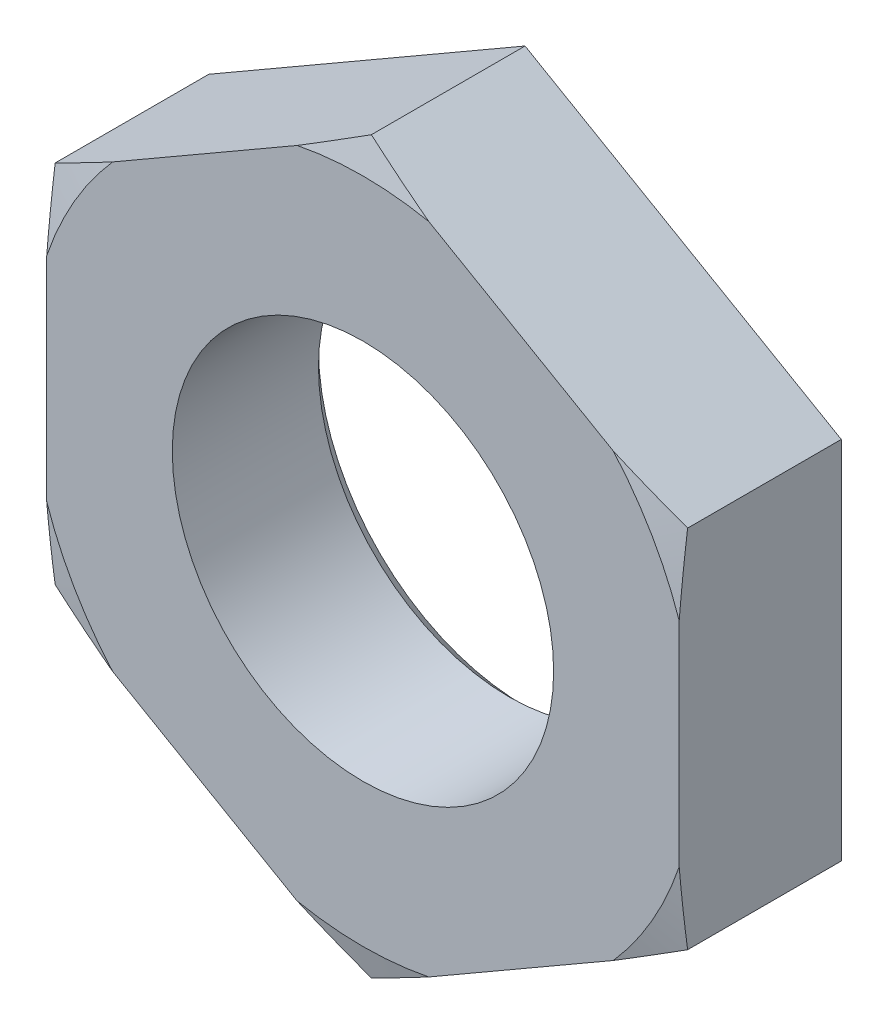
ISO-10303-21;
HEADER;
FILE_DESCRIPTION(('STEP AP214'),'2;1');
FILE_NAME('part.step','',(''),(''),'','','');
FILE_SCHEMA(('AUTOMOTIVE_DESIGN { 1 0 10303 214 1 1 1 1 }'));
ENDSEC;
DATA;
#1=APPLICATION_CONTEXT('core data for automotive mechanical design processes');
#2=APPLICATION_PROTOCOL_DEFINITION('international standard','automotive_design',2000,#1);
#3=PRODUCT_CONTEXT('',#1,'mechanical');
#4=PRODUCT('Part','Part','',(#3));
#5=PRODUCT_RELATED_PRODUCT_CATEGORY('part','',(#4));
#6=PRODUCT_DEFINITION_FORMATION('','',#4);
#7=PRODUCT_DEFINITION_CONTEXT('part definition',#1,'design');
#8=PRODUCT_DEFINITION('design','',#6,#7);
#9=PRODUCT_DEFINITION_SHAPE('','',#8);
#10=(LENGTH_UNIT() NAMED_UNIT(*) SI_UNIT(.MILLI.,.METRE.));
#11=(NAMED_UNIT(*) PLANE_ANGLE_UNIT() SI_UNIT($,.RADIAN.));
#12=(NAMED_UNIT(*) SI_UNIT($,.STERADIAN.) SOLID_ANGLE_UNIT());
#13=UNCERTAINTY_MEASURE_WITH_UNIT(LENGTH_MEASURE(1.E-05),#10,'distance_accuracy_value','');
#14=(GEOMETRIC_REPRESENTATION_CONTEXT(3) GLOBAL_UNCERTAINTY_ASSIGNED_CONTEXT((#13)) GLOBAL_UNIT_ASSIGNED_CONTEXT((#10,
#11,#12)) REPRESENTATION_CONTEXT('',''));
#15=CARTESIAN_POINT('',(0.,0.,0.));
#16=DIRECTION('',(0.,0.,1.));
#17=DIRECTION('',(1.,0.,0.));
#18=AXIS2_PLACEMENT_3D('',#15,#16,#17);
#19=CARTESIAN_POINT('',(0.,3.83,1.7));
#20=DIRECTION('',(0.,0.,1.));
#21=DIRECTION('',(1.,0.,0.));
#22=AXIS2_PLACEMENT_3D('',#19,#20,#21);
#23=PLANE('',#22);
#24=CARTESIAN_POINT('',(0.,0.,1.7));
#25=DIRECTION('',(0.,0.,1.));
#26=DIRECTION('',(1.,0.,0.));
#27=AXIS2_PLACEMENT_3D('',#24,#25,#26);
#28=CIRCLE('',#27,2.);
#29=CARTESIAN_POINT('',(2.,0.,1.7));
#30=VERTEX_POINT('',#29);
#31=EDGE_CURVE('E162',#30,#30,#28,.T.);
#32=ORIENTED_EDGE('',*,*,#31,.F.);
#33=EDGE_LOOP('',(#32));
#34=FACE_BOUND('',#33,.T.);
#35=DIRECTION('',(0.,1.,0.));
#36=VECTOR('',#35,1.);
#37=CARTESIAN_POINT('',(3.3168772964944,-1.915,1.7));
#38=LINE('',#37,#36);
#39=CARTESIAN_POINT('',(3.3168772964944,-1.11728465486644,1.7));
#40=VERTEX_POINT('',#39);
#41=CARTESIAN_POINT('',(3.3168772964944,1.11728465486644,1.7));
#42=VERTEX_POINT('',#41);
#43=EDGE_CURVE('E146',#40,#42,#38,.T.);
#44=ORIENTED_EDGE('',*,*,#43,.T.);
#45=CARTESIAN_POINT('',(0.,0.,1.7));
#46=DIRECTION('',(0.,0.,1.));
#47=DIRECTION('',(1.,0.,0.));
#48=AXIS2_PLACEMENT_3D('',#45,#46,#47);
#49=CIRCLE('',#48,3.5);
#50=CARTESIAN_POINT('',(2.62603554262006,2.31385767256678,1.7));
#51=VERTEX_POINT('',#50);
#52=EDGE_CURVE('E131',#42,#51,#49,.T.);
#53=ORIENTED_EDGE('',*,*,#52,.T.);
#54=DIRECTION('',(-0.866025403784439,0.5,0.));
#55=VECTOR('',#54,1.);
#56=CARTESIAN_POINT('',(3.3168772964944,1.915,1.7));
#57=LINE('',#56,#55);
#58=CARTESIAN_POINT('',(0.690841753874339,3.43114232743322,1.7));
#59=VERTEX_POINT('',#58);
#60=EDGE_CURVE('E143',#51,#59,#57,.T.);
#61=ORIENTED_EDGE('',*,*,#60,.T.);
#62=CARTESIAN_POINT('',(-0.690841753874347,3.43114232743322,1.7));
#63=VERTEX_POINT('',#62);
#64=EDGE_CURVE('E147',#59,#63,#49,.T.);
#65=ORIENTED_EDGE('',*,*,#64,.T.);
#66=DIRECTION('',(-0.866025403784439,-0.5,0.));
#67=VECTOR('',#66,1.);
#68=CARTESIAN_POINT('',(0.,3.83,1.7));
#69=LINE('',#68,#67);
#70=CARTESIAN_POINT('',(-2.62603554262006,2.31385767256679,1.7));
#71=VERTEX_POINT('',#70);
#72=EDGE_CURVE('E152',#63,#71,#69,.T.);
#73=ORIENTED_EDGE('',*,*,#72,.T.);
#74=CARTESIAN_POINT('',(-3.3168772964944,1.11728465486643,1.7));
#75=VERTEX_POINT('',#74);
#76=EDGE_CURVE('E316',#71,#75,#49,.T.);
#77=ORIENTED_EDGE('',*,*,#76,.T.);
#78=DIRECTION('',(0.,-1.,0.));
#79=VECTOR('',#78,1.);
#80=CARTESIAN_POINT('',(-3.3168772964944,1.915,1.7));
#81=LINE('',#80,#79);
#82=CARTESIAN_POINT('',(-3.3168772964944,-1.11728465486643,1.7));
#83=VERTEX_POINT('',#82);
#84=EDGE_CURVE('E156',#75,#83,#81,.T.);
#85=ORIENTED_EDGE('',*,*,#84,.T.);
#86=CARTESIAN_POINT('',(-2.62603554262006,-2.31385767256679,1.7));
#87=VERTEX_POINT('',#86);
#88=EDGE_CURVE('E314',#83,#87,#49,.T.);
#89=ORIENTED_EDGE('',*,*,#88,.T.);
#90=DIRECTION('',(0.866025403784439,-0.5,0.));
#91=VECTOR('',#90,1.);
#92=CARTESIAN_POINT('',(-3.3168772964944,-1.915,1.7));
#93=LINE('',#92,#91);
#94=CARTESIAN_POINT('',(-0.690841753874343,-3.43114232743322,1.7));
#95=VERTEX_POINT('',#94);
#96=EDGE_CURVE('E167',#87,#95,#93,.T.);
#97=ORIENTED_EDGE('',*,*,#96,.T.);
#98=CARTESIAN_POINT('',(0.690841753874338,-3.43114232743322,1.7));
#99=VERTEX_POINT('',#98);
#100=EDGE_CURVE('E317',#95,#99,#49,.T.);
#101=ORIENTED_EDGE('',*,*,#100,.T.);
#102=DIRECTION('',(0.866025403784439,0.5,0.));
#103=VECTOR('',#102,1.);
#104=CARTESIAN_POINT('',(0.,-3.83,1.7));
#105=LINE('',#104,#103);
#106=CARTESIAN_POINT('',(2.62603554262006,-2.31385767256678,1.7));
#107=VERTEX_POINT('',#106);
#108=EDGE_CURVE('E170',#99,#107,#105,.T.);
#109=ORIENTED_EDGE('',*,*,#108,.T.);
#110=EDGE_CURVE('E149',#107,#40,#49,.T.);
#111=ORIENTED_EDGE('',*,*,#110,.T.);
#112=EDGE_LOOP('',(#44,#53,#61,#65,#73,#77,#85,#89,#97,#101,#109,#111));
#113=FACE_BOUND('',#112,.T.);
#114=ADVANCED_FACE('F40',(#34,#113),#23,.T.);
#115=CARTESIAN_POINT('',(3.3168772964944,1.915,1.7));
#116=DIRECTION('',(-0.5,-0.866025403784439,0.));
#117=DIRECTION('',(0.866025403784439,-0.5,0.));
#118=AXIS2_PLACEMENT_3D('',#115,#116,#117);
#119=PLANE('',#118);
#120=CARTESIAN_POINT('',(5.83127776582853,0.463310212179416,1.07041199792404));
#121=CARTESIAN_POINT('',(5.72454057004419,0.524934960898053,1.09761167825971));
#122=CARTESIAN_POINT('',(5.61774329277782,0.586594397676514,1.12449721546284));
#123=CARTESIAN_POINT('',(5.4040056099263,0.709995906406806,1.17751349561719));
#124=CARTESIAN_POINT('',(5.29706520078815,0.771737980409962,1.20364421945372));
#125=CARTESIAN_POINT('',(4.97591681139783,0.957153089474277,1.28073302611032));
#126=CARTESIAN_POINT('',(4.76146753073402,1.08096543939305,1.33036565078184));
#127=CARTESIAN_POINT('',(4.33045714599396,1.32980940104625,1.42491878920381));
#128=CARTESIAN_POINT('',(4.11389107107299,1.45484388269921,1.4698094791682));
#129=CARTESIAN_POINT('',(3.67971957745825,1.70551291141215,1.55238021606378));
#130=CARTESIAN_POINT('',(3.46211419427549,1.83114743796982,1.59006050757825));
#131=CARTESIAN_POINT('',(3.03064158356245,2.08025826591295,1.65455481637842));
#132=CARTESIAN_POINT('',(2.81680078209559,2.20371931020356,1.68159481106668));
#133=CARTESIAN_POINT('',(2.49536833235979,2.38929842158481,1.71264945493049));
#134=CARTESIAN_POINT('',(2.38811767692694,2.45121961636972,1.72141657780274));
#135=CARTESIAN_POINT('',(2.17344775491806,2.57515935362847,1.73547903403678));
#136=CARTESIAN_POINT('',(2.06602849696467,2.63717789112401,1.74077453949432));
#137=CARTESIAN_POINT('',(1.85141126641249,2.76108720695604,1.74767480148922));
#138=CARTESIAN_POINT('',(1.7442135526138,2.82297783587423,1.74929019048154));
#139=CARTESIAN_POINT('',(1.52982412045231,2.94675563224408,1.74879555234484));
#140=CARTESIAN_POINT('',(1.42263240211828,3.00864279967912,1.74668550865365));
#141=CARTESIAN_POINT('',(1.20834183677083,3.13236351526727,1.73882591831331));
#142=CARTESIAN_POINT('',(1.10124299777306,3.19419705879253,1.73307608383068));
#143=CARTESIAN_POINT('',(0.887223122887742,3.3177614911695,1.71815886682356));
#144=CARTESIAN_POINT('',(0.780302092834531,3.37949237665275,1.70899137429633));
#145=CARTESIAN_POINT('',(0.540230967095622,3.51809750572277,1.68489942858229));
#146=CARTESIAN_POINT('',(0.407146114960128,3.59493408092826,1.66911135901775));
#147=CARTESIAN_POINT('',(0.141411769621497,3.74835587674245,1.63342195673454));
#148=CARTESIAN_POINT('',(0.00876223214955031,3.82494112290975,1.61352105631884));
#149=CARTESIAN_POINT('',(-0.256338287389561,3.97799697922797,1.57028019175486));
#150=CARTESIAN_POINT('',(-0.388788565033383,4.05446718267987,1.54693452469754));
#151=CARTESIAN_POINT('',(-0.65330013437474,4.20718300844287,1.4974665893571));
#152=CARTESIAN_POINT('',(-0.785361415394538,4.28342862458918,1.47134424557242));
#153=CARTESIAN_POINT('',(-1.05113855194364,4.43687512592025,1.41644690357126));
#154=CARTESIAN_POINT('',(-1.18484906766289,4.51407292816425,1.38763763772524));
#155=CARTESIAN_POINT('',(-1.45195973971002,4.66828934657408,1.32816566356498));
#156=CARTESIAN_POINT('',(-1.58535989478451,4.74530796201628,1.29750294777909));
#157=CARTESIAN_POINT('',(-1.85149667072547,4.89896210124705,1.23478224796359));
#158=CARTESIAN_POINT('',(-1.98423408225671,4.97559808152614,1.20272871801099));
#159=CARTESIAN_POINT('',(-2.24947851844549,5.12873702816078,1.13741133476902));
#160=CARTESIAN_POINT('',(-2.38198555466086,5.20524000118925,1.10414754414812));
#161=CARTESIAN_POINT('',(-2.51440046933414,5.28168978782058,1.07041199792404));
#162=B_SPLINE_CURVE_WITH_KNOTS('',3,(#120,#121,#122,#123,#124,#125,#126,#127,#128,#129,#130,
#131,#132,#133,#134,#135,#136,#137,#138,#139,#140,#141,#142,#143,#144,#145,#146,#147,#148,#149,
#150,#151,#152,#153,#154,#155,#156,#157,#158,#159,#160,#161),.UNSPECIFIED.,.F.,.F.,(4,2,2,2,2,2,
2,2,2,2,2,2,2,2,2,2,2,2,2,2,4),(0.,0.378644677792938,0.75729893588407,1.51491215740246,
2.27703740739011,3.03913680080998,3.7840422528208,4.15645781003339,4.52885490438812,
4.90017471104937,5.27149616849226,5.64284699358403,6.01420977222405,6.4775870497984,
6.94091564616266,7.40502008598296,7.86913714865619,8.3403044432172,8.8114736372795,
9.28123161893634,9.75096531059096),.UNSPECIFIED.);
#163=CARTESIAN_POINT('',(3.3168772964944,1.91500000000002,1.61157676649776));
#164=VERTEX_POINT('',#163);
#165=EDGE_CURVE('E128',#164,#51,#162,.T.);
#166=ORIENTED_EDGE('',*,*,#165,.F.);
#167=DIRECTION('',(0.,0.,-1.));
#168=VECTOR('',#167,1.);
#169=CARTESIAN_POINT('',(3.3168772964944,1.915,1.7));
#170=LINE('',#169,#168);
#171=CARTESIAN_POINT('',(3.3168772964944,1.915,0.));
#172=VERTEX_POINT('',#171);
#173=EDGE_CURVE('E174',#164,#172,#170,.T.);
#174=ORIENTED_EDGE('',*,*,#173,.T.);
#175=DIRECTION('',(-0.866025403784439,0.5,0.));
#176=VECTOR('',#175,1.);
#177=CARTESIAN_POINT('',(3.3168772964944,1.915,0.));
#178=LINE('',#177,#176);
#179=CARTESIAN_POINT('',(0.,3.83,0.));
#180=VERTEX_POINT('',#179);
#181=EDGE_CURVE('E175',#172,#180,#178,.T.);
#182=ORIENTED_EDGE('',*,*,#181,.T.);
#183=DIRECTION('',(0.,0.,-1.));
#184=VECTOR('',#183,1.);
#185=CARTESIAN_POINT('',(0.,3.83,1.7));
#186=LINE('',#185,#184);
#187=CARTESIAN_POINT('',(0.,3.83,1.61157676649773));
#188=VERTEX_POINT('',#187);
#189=EDGE_CURVE('E198',#188,#180,#186,.T.);
#190=ORIENTED_EDGE('',*,*,#189,.F.);
#191=EDGE_CURVE('E55',#59,#188,#162,.T.);
#192=ORIENTED_EDGE('',*,*,#191,.F.);
#193=ORIENTED_EDGE('',*,*,#60,.F.);
#194=EDGE_LOOP('',(#166,#174,#182,#190,#192,#193));
#195=FACE_BOUND('',#194,.T.);
#196=ADVANCED_FACE('F150',(#195),#119,.F.);
#197=CARTESIAN_POINT('',(0.,3.83,1.7));
#198=DIRECTION('',(0.5,-0.866025403784439,0.));
#199=DIRECTION('',(0.866025403784439,0.5,0.));
#200=AXIS2_PLACEMENT_3D('',#197,#198,#199);
#201=PLANE('',#200);
#202=CARTESIAN_POINT('',(2.51440046933414,5.28168978782059,1.07041199792404));
#203=CARTESIAN_POINT('',(2.40766327354979,5.22006503910195,1.09761167825971));
#204=CARTESIAN_POINT('',(2.30086599628342,5.15840560232349,1.12449721546284));
#205=CARTESIAN_POINT('',(2.0871283134319,5.0350040935932,1.17751349561718));
#206=CARTESIAN_POINT('',(1.98018790429375,4.97326201959004,1.20364421945372));
#207=CARTESIAN_POINT('',(1.65903951490343,4.78784691052573,1.28073302611032));
#208=CARTESIAN_POINT('',(1.44459023423962,4.66403456060695,1.33036565078184));
#209=CARTESIAN_POINT('',(1.01357984949956,4.41519059895375,1.42491878920381));
#210=CARTESIAN_POINT('',(0.797013774578592,4.29015611730079,1.4698094791682));
#211=CARTESIAN_POINT('',(0.362842280963847,4.03948708858786,1.55238021606378));
#212=CARTESIAN_POINT('',(0.145236897781087,3.91385256203018,1.59006050757825));
#213=CARTESIAN_POINT('',(-0.28623571293195,3.66474173408705,1.65455481637842));
#214=CARTESIAN_POINT('',(-0.500076514398812,3.54128068979644,1.68159481106668));
#215=CARTESIAN_POINT('',(-0.82150896413461,3.35570157841519,1.71264945493049));
#216=CARTESIAN_POINT('',(-0.928759619567454,3.29378038363028,1.72141657780274));
#217=CARTESIAN_POINT('',(-1.14342954157634,3.16984064637153,1.73547903403678));
#218=CARTESIAN_POINT('',(-1.25084879952973,3.10782210887599,1.74077453949432));
#219=CARTESIAN_POINT('',(-1.46546603008191,2.98391279304396,1.74767480148922));
#220=CARTESIAN_POINT('',(-1.5726637438806,2.92202216412577,1.74929019048154));
#221=CARTESIAN_POINT('',(-1.78705317604209,2.79824436775592,1.74879555234484));
#222=CARTESIAN_POINT('',(-1.89424489437612,2.73635720032088,1.74668550865365));
#223=CARTESIAN_POINT('',(-2.10853545972357,2.61263648473273,1.73882591831331));
#224=CARTESIAN_POINT('',(-2.21563429872134,2.55080294120747,1.73307608383068));
#225=CARTESIAN_POINT('',(-2.42965417360666,2.4272385088305,1.71815886682356));
#226=CARTESIAN_POINT('',(-2.53657520365987,2.36550762334725,1.70899137429633));
#227=CARTESIAN_POINT('',(-2.77664632939878,2.22690249427723,1.68489942858229));
#228=CARTESIAN_POINT('',(-2.90973118153427,2.15006591907174,1.66911135901775));
#229=CARTESIAN_POINT('',(-3.1754655268729,1.99664412325755,1.63342195673454));
#230=CARTESIAN_POINT('',(-3.30811506434485,1.92005887709025,1.61352105631884));
#231=CARTESIAN_POINT('',(-3.57321558388396,1.76700302077203,1.57028019175486));
#232=CARTESIAN_POINT('',(-3.70566586152778,1.69053281732013,1.54693452469754));
#233=CARTESIAN_POINT('',(-3.97017743086914,1.53781699155713,1.4974665893571));
#234=CARTESIAN_POINT('',(-4.10223871188894,1.46157137541082,1.47134424557242));
#235=CARTESIAN_POINT('',(-4.36801584843804,1.30812487407975,1.41644690357126));
#236=CARTESIAN_POINT('',(-4.50172636415729,1.23092707183575,1.38763763772524));
#237=CARTESIAN_POINT('',(-4.76883703620442,1.07671065342592,1.32816566356498));
#238=CARTESIAN_POINT('',(-4.90223719127891,0.999692037983725,1.29750294777909));
#239=CARTESIAN_POINT('',(-5.16837396721987,0.846037898752953,1.23478224796359));
#240=CARTESIAN_POINT('',(-5.30111137875111,0.769401918473859,1.20272871801099));
#241=CARTESIAN_POINT('',(-5.56635581493989,0.616262971839215,1.13741133476902));
#242=CARTESIAN_POINT('',(-5.69886285115526,0.539759998810751,1.10414754414812));
#243=CARTESIAN_POINT('',(-5.83127776582854,0.463310212179415,1.07041199792404));
#244=B_SPLINE_CURVE_WITH_KNOTS('',3,(#202,#203,#204,#205,#206,#207,#208,#209,#210,#211,#212,
#213,#214,#215,#216,#217,#218,#219,#220,#221,#222,#223,#224,#225,#226,#227,#228,#229,#230,#231,
#232,#233,#234,#235,#236,#237,#238,#239,#240,#241,#242,#243),.UNSPECIFIED.,.F.,.F.,(4,2,2,2,2,2,
2,2,2,2,2,2,2,2,2,2,2,2,2,2,4),(0.,0.378644677792938,0.75729893588407,1.51491215740246,
2.27703740739011,3.03913680080998,3.7840422528208,4.15645781003339,4.52885490438812,
4.90017471104937,5.27149616849226,5.64284699358403,6.01420977222405,6.4775870497984,
6.94091564616267,7.40502008598296,7.86913714865619,8.34030444321721,8.8114736372795,
9.28123161893634,9.75096531059097),.UNSPECIFIED.);
#245=EDGE_CURVE('E309',#188,#63,#244,.T.);
#246=ORIENTED_EDGE('',*,*,#245,.F.);
#247=ORIENTED_EDGE('',*,*,#189,.T.);
#248=DIRECTION('',(-0.866025403784439,-0.5,0.));
#249=VECTOR('',#248,1.);
#250=CARTESIAN_POINT('',(0.,3.83,0.));
#251=LINE('',#250,#249);
#252=CARTESIAN_POINT('',(-3.3168772964944,1.915,0.));
#253=VERTEX_POINT('',#252);
#254=EDGE_CURVE('E178',#180,#253,#251,.T.);
#255=ORIENTED_EDGE('',*,*,#254,.T.);
#256=DIRECTION('',(0.,0.,-1.));
#257=VECTOR('',#256,1.);
#258=CARTESIAN_POINT('',(-3.3168772964944,1.915,1.7));
#259=LINE('',#258,#257);
#260=CARTESIAN_POINT('',(-3.3168772964944,1.915,1.61157676649773));
#261=VERTEX_POINT('',#260);
#262=EDGE_CURVE('E196',#261,#253,#259,.T.);
#263=ORIENTED_EDGE('',*,*,#262,.F.);
#264=EDGE_CURVE('E63',#71,#261,#244,.T.);
#265=ORIENTED_EDGE('',*,*,#264,.F.);
#266=ORIENTED_EDGE('',*,*,#72,.F.);
#267=EDGE_LOOP('',(#246,#247,#255,#263,#265,#266));
#268=FACE_BOUND('',#267,.T.);
#269=ADVANCED_FACE('F262',(#268),#201,.F.);
#270=CARTESIAN_POINT('',(-3.3168772964944,1.915,1.7));
#271=DIRECTION('',(1.,0.,0.));
#272=DIRECTION('',(0.,1.,0.));
#273=AXIS2_PLACEMENT_3D('',#270,#271,#272);
#274=PLANE('',#273);
#275=CARTESIAN_POINT('',(-3.3168772964944,4.42940046933414,1.15508558009258));
#276=CARTESIAN_POINT('',(-3.3168772964944,4.31261414766034,1.18013106176752));
#277=CARTESIAN_POINT('',(-3.3168772964944,4.19575609414231,1.20484207574603));
#278=CARTESIAN_POINT('',(-3.3168772964944,3.96187035183646,1.25346502622969));
#279=CARTESIAN_POINT('',(-3.3168772964944,3.84484265805379,1.27737693868625));
#280=CARTESIAN_POINT('',(-3.3168772964944,3.49336210948602,1.34773944299208));
#281=CARTESIAN_POINT('',(-3.3168772964944,3.25862570622043,1.39279210586532));
#282=CARTESIAN_POINT('',(-3.3168772964944,2.78712363481906,1.47790136933605));
#283=CARTESIAN_POINT('',(-3.3168772964944,2.55035359810239,1.51793407619066));
#284=CARTESIAN_POINT('',(-3.3168772964944,2.07568839182853,1.59068263671723));
#285=CARTESIAN_POINT('',(-3.3168772964944,1.83779332464369,1.62339914352676));
#286=CARTESIAN_POINT('',(-3.3168772964944,1.36574060266296,1.67832505469384));
#287=CARTESIAN_POINT('',(-3.3168772964944,1.13160733292008,1.700737658205));
#288=CARTESIAN_POINT('',(-3.3168772964944,0.662501437500895,1.73353757029341));
#289=CARTESIAN_POINT('',(-3.3168772964944,0.427528956548072,1.74392686053913));
#290=CARTESIAN_POINT('',(-3.3168772964944,-0.0420777814691951,1.75121028460556));
#291=CARTESIAN_POINT('',(-3.3168772964944,-0.276711523467778,1.74813628872953));
#292=CARTESIAN_POINT('',(-3.3168772964944,-0.745453993516248,1.72902153534255));
#293=CARTESIAN_POINT('',(-3.3168772964944,-0.979562666522371,1.71297947674267));
#294=CARTESIAN_POINT('',(-3.3168772964944,-1.34761483984397,1.67911471645908));
#295=CARTESIAN_POINT('',(-3.3168772964944,-1.48191356070077,1.66493531422273));
#296=CARTESIAN_POINT('',(-3.3168772964944,-1.7501290314242,1.63345459980087));
#297=CARTESIAN_POINT('',(-3.3168772964944,-1.88404582144436,1.61615362908475));
#298=CARTESIAN_POINT('',(-3.3168772964944,-2.28554916041534,1.56025112300066));
#299=CARTESIAN_POINT('',(-3.3168772964944,-2.55258301147016,1.51768031915314));
#300=CARTESIAN_POINT('',(-3.3168772964944,-2.95386825731731,1.44803878843683));
#301=CARTESIAN_POINT('',(-3.3168772964944,-3.08861098994295,1.42368712649009));
#302=CARTESIAN_POINT('',(-3.3168772964944,-3.35780677365734,1.3734199199636));
#303=CARTESIAN_POINT('',(-3.3168772964944,-3.49225982411678,1.34750437199003));
#304=CARTESIAN_POINT('',(-3.3168772964944,-3.76062289275526,1.294443281552));
#305=CARTESIAN_POINT('',(-3.3168772964944,-3.89453345743434,1.26730048354005));
#306=CARTESIAN_POINT('',(-3.3168772964944,-4.16212746482975,1.21194406949389));
#307=CARTESIAN_POINT('',(-3.3168772964944,-4.29581091690068,1.18373049873888));
#308=CARTESIAN_POINT('',(-3.3168772964944,-4.42940046933414,1.15508558009258));
#309=B_SPLINE_CURVE_WITH_KNOTS('',3,(#275,#276,#277,#278,#279,#280,#281,#282,#283,#284,#285,
#286,#287,#288,#289,#290,#291,#292,#293,#294,#295,#296,#297,#298,#299,#300,#301,#302,#303,#304,
#305,#306,#307,#308),.UNSPECIFIED.,.F.,.F.,(4,2,2,2,2,2,2,2,2,2,2,2,2,2,2,2,4),(0.,
0.358324147617178,0.716659069135222,1.43367857395301,2.1539908740305,2.87423884412771,
3.57959964764408,4.2848441778508,4.98842015604283,5.69206673294867,6.09716918992448,
6.50222735945047,7.31326445750313,7.7240375117298,8.13481145741815,8.54470831329544,
8.95458785534944),.UNSPECIFIED.);
#310=EDGE_CURVE('E307',#261,#75,#309,.T.);
#311=ORIENTED_EDGE('',*,*,#310,.F.);
#312=ORIENTED_EDGE('',*,*,#262,.T.);
#313=DIRECTION('',(0.,-1.,0.));
#314=VECTOR('',#313,1.);
#315=CARTESIAN_POINT('',(-3.3168772964944,1.915,0.));
#316=LINE('',#315,#314);
#317=CARTESIAN_POINT('',(-3.3168772964944,-1.915,0.));
#318=VERTEX_POINT('',#317);
#319=EDGE_CURVE('E181',#253,#318,#316,.T.);
#320=ORIENTED_EDGE('',*,*,#319,.T.);
#321=DIRECTION('',(0.,0.,-1.));
#322=VECTOR('',#321,1.);
#323=CARTESIAN_POINT('',(-3.3168772964944,-1.915,1.7));
#324=LINE('',#323,#322);
#325=CARTESIAN_POINT('',(-3.3168772964944,-1.915,1.61157676649773));
#326=VERTEX_POINT('',#325);
#327=EDGE_CURVE('E194',#326,#318,#324,.T.);
#328=ORIENTED_EDGE('',*,*,#327,.F.);
#329=EDGE_CURVE('E247',#83,#326,#309,.T.);
#330=ORIENTED_EDGE('',*,*,#329,.F.);
#331=ORIENTED_EDGE('',*,*,#84,.F.);
#332=EDGE_LOOP('',(#311,#312,#320,#328,#330,#331));
#333=FACE_BOUND('',#332,.T.);
#334=ADVANCED_FACE('F257',(#333),#274,.F.);
#335=CARTESIAN_POINT('',(-3.3168772964944,-1.915,1.7));
#336=DIRECTION('',(0.5,0.866025403784439,0.));
#337=DIRECTION('',(-0.866025403784439,0.5,0.));
#338=AXIS2_PLACEMENT_3D('',#335,#336,#337);
#339=PLANE('',#338);
#340=CARTESIAN_POINT('',(-5.83127776582854,-0.463310212179414,1.07041199792404));
#341=CARTESIAN_POINT('',(-5.72454057004419,-0.524934960898051,1.09761167825971));
#342=CARTESIAN_POINT('',(-5.61774329277782,-0.586594397676512,1.12449721546284));
#343=CARTESIAN_POINT('',(-5.4040056099263,-0.709995906406804,1.17751349561718));
#344=CARTESIAN_POINT('',(-5.29706520078815,-0.77173798040996,1.20364421945372));
#345=CARTESIAN_POINT('',(-4.97591681139783,-0.957153089474275,1.28073302611032));
#346=CARTESIAN_POINT('',(-4.76146753073402,-1.08096543939305,1.33036565078184));
#347=CARTESIAN_POINT('',(-4.33045714599396,-1.32980940104625,1.42491878920381));
#348=CARTESIAN_POINT('',(-4.11389107107299,-1.45484388269921,1.4698094791682));
#349=CARTESIAN_POINT('',(-3.67971957745825,-1.70551291141214,1.55238021606378));
#350=CARTESIAN_POINT('',(-3.46211419427549,-1.83114743796982,1.59006050757825));
#351=CARTESIAN_POINT('',(-3.03064158356245,-2.08025826591295,1.65455481637842));
#352=CARTESIAN_POINT('',(-2.81680078209559,-2.20371931020356,1.68159481106668));
#353=CARTESIAN_POINT('',(-2.49536833235979,-2.38929842158481,1.71264945493049));
#354=CARTESIAN_POINT('',(-2.38811767692695,-2.45121961636972,1.72141657780274));
#355=CARTESIAN_POINT('',(-2.17344775491806,-2.57515935362847,1.73547903403678));
#356=CARTESIAN_POINT('',(-2.06602849696467,-2.63717789112401,1.74077453949432));
#357=CARTESIAN_POINT('',(-1.85141126641249,-2.76108720695604,1.74767480148922));
#358=CARTESIAN_POINT('',(-1.7442135526138,-2.82297783587423,1.74929019048154));
#359=CARTESIAN_POINT('',(-1.52982412045231,-2.94675563224408,1.74879555234484));
#360=CARTESIAN_POINT('',(-1.42263240211828,-3.00864279967912,1.74668550865365));
#361=CARTESIAN_POINT('',(-1.20834183677083,-3.13236351526727,1.73882591831331));
#362=CARTESIAN_POINT('',(-1.10124299777306,-3.19419705879253,1.73307608383068));
#363=CARTESIAN_POINT('',(-0.887223122887742,-3.3177614911695,1.71815886682356));
#364=CARTESIAN_POINT('',(-0.780302092834531,-3.37949237665275,1.70899137429633));
#365=CARTESIAN_POINT('',(-0.540230967095622,-3.51809750572277,1.68489942858229));
#366=CARTESIAN_POINT('',(-0.407146114960128,-3.59493408092826,1.66911135901775));
#367=CARTESIAN_POINT('',(-0.141411769621497,-3.74835587674245,1.63342195673454));
#368=CARTESIAN_POINT('',(-0.00876223214955061,-3.82494112290975,1.61352105631884));
#369=CARTESIAN_POINT('',(0.25633828738956,-3.97799697922797,1.57028019175486));
#370=CARTESIAN_POINT('',(0.388788565033383,-4.05446718267987,1.54693452469754));
#371=CARTESIAN_POINT('',(0.653300134374739,-4.20718300844287,1.4974665893571));
#372=CARTESIAN_POINT('',(0.785361415394537,-4.28342862458918,1.47134424557242));
#373=CARTESIAN_POINT('',(1.05113855194364,-4.43687512592025,1.41644690357126));
#374=CARTESIAN_POINT('',(1.18484906766289,-4.51407292816425,1.38763763772524));
#375=CARTESIAN_POINT('',(1.45195973971002,-4.66828934657408,1.32816566356498));
#376=CARTESIAN_POINT('',(1.58535989478451,-4.74530796201628,1.29750294777909));
#377=CARTESIAN_POINT('',(1.85149667072547,-4.89896210124705,1.23478224796359));
#378=CARTESIAN_POINT('',(1.98423408225671,-4.97559808152614,1.20272871801099));
#379=CARTESIAN_POINT('',(2.24947851844549,-5.12873702816078,1.13741133476902));
#380=CARTESIAN_POINT('',(2.38198555466086,-5.20524000118925,1.10414754414812));
#381=CARTESIAN_POINT('',(2.51440046933414,-5.28168978782058,1.07041199792404));
#382=B_SPLINE_CURVE_WITH_KNOTS('',3,(#340,#341,#342,#343,#344,#345,#346,#347,#348,#349,#350,
#351,#352,#353,#354,#355,#356,#357,#358,#359,#360,#361,#362,#363,#364,#365,#366,#367,#368,#369,
#370,#371,#372,#373,#374,#375,#376,#377,#378,#379,#380,#381),.UNSPECIFIED.,.F.,.F.,(4,2,2,2,2,2,
2,2,2,2,2,2,2,2,2,2,2,2,2,2,4),(0.,0.378644677792938,0.75729893588407,1.51491215740246,
2.27703740739011,3.03913680080998,3.7840422528208,4.15645781003339,4.52885490438812,
4.90017471104937,5.27149616849226,5.64284699358403,6.01420977222405,6.4775870497984,
6.94091564616267,7.40502008598296,7.86913714865619,8.34030444321721,8.8114736372795,
9.28123161893634,9.75096531059097),.UNSPECIFIED.);
#383=EDGE_CURVE('E245',#326,#87,#382,.T.);
#384=ORIENTED_EDGE('',*,*,#383,.F.);
#385=ORIENTED_EDGE('',*,*,#327,.T.);
#386=DIRECTION('',(0.866025403784439,-0.5,0.));
#387=VECTOR('',#386,1.);
#388=CARTESIAN_POINT('',(-3.3168772964944,-1.915,0.));
#389=LINE('',#388,#387);
#390=CARTESIAN_POINT('',(0.,-3.83,0.));
#391=VERTEX_POINT('',#390);
#392=EDGE_CURVE('E184',#318,#391,#389,.T.);
#393=ORIENTED_EDGE('',*,*,#392,.T.);
#394=DIRECTION('',(0.,0.,-1.));
#395=VECTOR('',#394,1.);
#396=CARTESIAN_POINT('',(0.,-3.83,1.7));
#397=LINE('',#396,#395);
#398=CARTESIAN_POINT('',(0.,-3.83,1.61157676649773));
#399=VERTEX_POINT('',#398);
#400=EDGE_CURVE('E192',#399,#391,#397,.T.);
#401=ORIENTED_EDGE('',*,*,#400,.F.);
#402=EDGE_CURVE('E239',#95,#399,#382,.T.);
#403=ORIENTED_EDGE('',*,*,#402,.F.);
#404=ORIENTED_EDGE('',*,*,#96,.F.);
#405=EDGE_LOOP('',(#384,#385,#393,#401,#403,#404));
#406=FACE_BOUND('',#405,.T.);
#407=ADVANCED_FACE('F253',(#406),#339,.F.);
#408=CARTESIAN_POINT('',(0.,-3.83,1.7));
#409=DIRECTION('',(-0.5,0.866025403784439,0.));
#410=DIRECTION('',(-0.866025403784439,-0.5,0.));
#411=AXIS2_PLACEMENT_3D('',#408,#409,#410);
#412=PLANE('',#411);
#413=CARTESIAN_POINT('',(-2.51440046933414,-5.28168978782058,1.07041199792404));
#414=CARTESIAN_POINT('',(-2.40766327354979,-5.22006503910195,1.09761167825971));
#415=CARTESIAN_POINT('',(-2.30086599628342,-5.15840560232349,1.12449721546284));
#416=CARTESIAN_POINT('',(-2.0871283134319,-5.0350040935932,1.17751349561718));
#417=CARTESIAN_POINT('',(-1.98018790429375,-4.97326201959004,1.20364421945372));
#418=CARTESIAN_POINT('',(-1.65903951490344,-4.78784691052572,1.28073302611032));
#419=CARTESIAN_POINT('',(-1.44459023423962,-4.66403456060695,1.33036565078184));
#420=CARTESIAN_POINT('',(-1.01357984949956,-4.41519059895375,1.42491878920381));
#421=CARTESIAN_POINT('',(-0.797013774578594,-4.29015611730079,1.4698094791682));
#422=CARTESIAN_POINT('',(-0.36284228096385,-4.03948708858786,1.55238021606378));
#423=CARTESIAN_POINT('',(-0.145236897781089,-3.91385256203018,1.59006050757825));
#424=CARTESIAN_POINT('',(0.286235712931948,-3.66474173408705,1.65455481637842));
#425=CARTESIAN_POINT('',(0.50007651439881,-3.54128068979644,1.68159481106668));
#426=CARTESIAN_POINT('',(0.821508964134609,-3.35570157841519,1.71264945493049));
#427=CARTESIAN_POINT('',(0.928759619567452,-3.29378038363028,1.72141657780274));
#428=CARTESIAN_POINT('',(1.14342954157634,-3.16984064637153,1.73547903403678));
#429=CARTESIAN_POINT('',(1.25084879952973,-3.10782210887599,1.74077453949432));
#430=CARTESIAN_POINT('',(1.46546603008191,-2.98391279304396,1.74767480148922));
#431=CARTESIAN_POINT('',(1.5726637438806,-2.92202216412577,1.74929019048154));
#432=CARTESIAN_POINT('',(1.78705317604209,-2.79824436775592,1.74879555234484));
#433=CARTESIAN_POINT('',(1.89424489437611,-2.73635720032087,1.74668550865365));
#434=CARTESIAN_POINT('',(2.10853545972356,-2.61263648473273,1.73882591831331));
#435=CARTESIAN_POINT('',(2.21563429872133,-2.55080294120747,1.73307608383068));
#436=CARTESIAN_POINT('',(2.42965417360666,-2.4272385088305,1.71815886682357));
#437=CARTESIAN_POINT('',(2.53657520365987,-2.36550762334724,1.70899137429633));
#438=CARTESIAN_POINT('',(2.77664632939878,-2.22690249427723,1.68489942858229));
#439=CARTESIAN_POINT('',(2.90973118153427,-2.15006591907174,1.66911135901775));
#440=CARTESIAN_POINT('',(3.1754655268729,-1.99664412325755,1.63342195673454));
#441=CARTESIAN_POINT('',(3.30811506434485,-1.92005887709025,1.61352105631884));
#442=CARTESIAN_POINT('',(3.57321558388396,-1.76700302077203,1.57028019175486));
#443=CARTESIAN_POINT('',(3.70566586152778,-1.69053281732013,1.54693452469754));
#444=CARTESIAN_POINT('',(3.97017743086914,-1.53781699155713,1.4974665893571));
#445=CARTESIAN_POINT('',(4.10223871188893,-1.46157137541082,1.47134424557242));
#446=CARTESIAN_POINT('',(4.36801584843804,-1.30812487407975,1.41644690357126));
#447=CARTESIAN_POINT('',(4.50172636415729,-1.23092707183575,1.38763763772524));
#448=CARTESIAN_POINT('',(4.76883703620442,-1.07671065342592,1.32816566356498));
#449=CARTESIAN_POINT('',(4.90223719127891,-0.999692037983725,1.29750294777909));
#450=CARTESIAN_POINT('',(5.16837396721987,-0.846037898752953,1.23478224796359));
#451=CARTESIAN_POINT('',(5.30111137875111,-0.769401918473859,1.20272871801099));
#452=CARTESIAN_POINT('',(5.56635581493989,-0.616262971839216,1.13741133476902));
#453=CARTESIAN_POINT('',(5.69886285115526,-0.539759998810752,1.10414754414812));
#454=CARTESIAN_POINT('',(5.83127776582853,-0.463310212179415,1.07041199792404));
#455=B_SPLINE_CURVE_WITH_KNOTS('',3,(#413,#414,#415,#416,#417,#418,#419,#420,#421,#422,#423,
#424,#425,#426,#427,#428,#429,#430,#431,#432,#433,#434,#435,#436,#437,#438,#439,#440,#441,#442,
#443,#444,#445,#446,#447,#448,#449,#450,#451,#452,#453,#454),.UNSPECIFIED.,.F.,.F.,(4,2,2,2,2,2,
2,2,2,2,2,2,2,2,2,2,2,2,2,2,4),(0.,0.378644677792938,0.75729893588407,1.51491215740246,
2.27703740739011,3.03913680080998,3.7840422528208,4.15645781003339,4.52885490438812,
4.90017471104937,5.27149616849226,5.64284699358403,6.01420977222405,6.4775870497984,
6.94091564616267,7.40502008598296,7.86913714865619,8.34030444321721,8.8114736372795,
9.28123161893634,9.75096531059096),.UNSPECIFIED.);
#456=EDGE_CURVE('E246',#399,#99,#455,.T.);
#457=ORIENTED_EDGE('',*,*,#456,.F.);
#458=ORIENTED_EDGE('',*,*,#400,.T.);
#459=DIRECTION('',(0.866025403784439,0.5,0.));
#460=VECTOR('',#459,1.);
#461=CARTESIAN_POINT('',(0.,-3.83,0.));
#462=LINE('',#461,#460);
#463=CARTESIAN_POINT('',(3.3168772964944,-1.915,0.));
#464=VERTEX_POINT('',#463);
#465=EDGE_CURVE('E159',#391,#464,#462,.T.);
#466=ORIENTED_EDGE('',*,*,#465,.T.);
#467=DIRECTION('',(0.,0.,-1.));
#468=VECTOR('',#467,1.);
#469=CARTESIAN_POINT('',(3.3168772964944,-1.915,1.7));
#470=LINE('',#469,#468);
#471=CARTESIAN_POINT('',(3.3168772964944,-1.915,1.61157676649773));
#472=VERTEX_POINT('',#471);
#473=EDGE_CURVE('E190',#472,#464,#470,.T.);
#474=ORIENTED_EDGE('',*,*,#473,.F.);
#475=EDGE_CURVE('E137',#107,#472,#455,.T.);
#476=ORIENTED_EDGE('',*,*,#475,.F.);
#477=ORIENTED_EDGE('',*,*,#108,.F.);
#478=EDGE_LOOP('',(#457,#458,#466,#474,#476,#477));
#479=FACE_BOUND('',#478,.T.);
#480=ADVANCED_FACE('F256',(#479),#412,.F.);
#481=CARTESIAN_POINT('',(3.3168772964944,-1.915,1.7));
#482=DIRECTION('',(-1.,0.,0.));
#483=DIRECTION('',(0.,-1.,0.));
#484=AXIS2_PLACEMENT_3D('',#481,#482,#483);
#485=PLANE('',#484);
#486=CARTESIAN_POINT('',(3.3168772964944,-4.42940046933414,1.15508558009258));
#487=CARTESIAN_POINT('',(3.3168772964944,-4.31261414766034,1.18013106176752));
#488=CARTESIAN_POINT('',(3.3168772964944,-4.1957560941423,1.20484207574603));
#489=CARTESIAN_POINT('',(3.3168772964944,-3.96187035183646,1.25346502622969));
#490=CARTESIAN_POINT('',(3.3168772964944,-3.84484265805379,1.27737693868625));
#491=CARTESIAN_POINT('',(3.3168772964944,-3.49336210948602,1.34773944299208));
#492=CARTESIAN_POINT('',(3.3168772964944,-3.25862570622043,1.39279210586532));
#493=CARTESIAN_POINT('',(3.3168772964944,-2.78712363481906,1.47790136933605));
#494=CARTESIAN_POINT('',(3.3168772964944,-2.55035359810239,1.51793407619066));
#495=CARTESIAN_POINT('',(3.3168772964944,-2.07568839182853,1.59068263671723));
#496=CARTESIAN_POINT('',(3.3168772964944,-1.83779332464369,1.62339914352676));
#497=CARTESIAN_POINT('',(3.3168772964944,-1.36574060266296,1.67832505469384));
#498=CARTESIAN_POINT('',(3.3168772964944,-1.13160733292008,1.700737658205));
#499=CARTESIAN_POINT('',(3.3168772964944,-0.662501437500896,1.73353757029341));
#500=CARTESIAN_POINT('',(3.3168772964944,-0.427528956548073,1.74392686053913));
#501=CARTESIAN_POINT('',(3.3168772964944,0.0420777814691944,1.75121028460556));
#502=CARTESIAN_POINT('',(3.3168772964944,0.276711523467777,1.74813628872953));
#503=CARTESIAN_POINT('',(3.3168772964944,0.745453993516247,1.72902153534255));
#504=CARTESIAN_POINT('',(3.3168772964944,0.97956266652237,1.71297947674267));
#505=CARTESIAN_POINT('',(3.3168772964944,1.34761483984397,1.67911471645909));
#506=CARTESIAN_POINT('',(3.3168772964944,1.48191356070076,1.66493531422273));
#507=CARTESIAN_POINT('',(3.3168772964944,1.7501290314242,1.63345459980087));
#508=CARTESIAN_POINT('',(3.3168772964944,1.88404582144436,1.61615362908475));
#509=CARTESIAN_POINT('',(3.3168772964944,2.28554916041534,1.56025112300066));
#510=CARTESIAN_POINT('',(3.3168772964944,2.55258301147016,1.51768031915314));
#511=CARTESIAN_POINT('',(3.3168772964944,2.95386825731731,1.44803878843683));
#512=CARTESIAN_POINT('',(3.3168772964944,3.08861098994295,1.42368712649009));
#513=CARTESIAN_POINT('',(3.3168772964944,3.35780677365734,1.3734199199636));
#514=CARTESIAN_POINT('',(3.3168772964944,3.49225982411678,1.34750437199003));
#515=CARTESIAN_POINT('',(3.3168772964944,3.76062289275526,1.294443281552));
#516=CARTESIAN_POINT('',(3.3168772964944,3.89453345743434,1.26730048354005));
#517=CARTESIAN_POINT('',(3.3168772964944,4.16212746482976,1.21194406949389));
#518=CARTESIAN_POINT('',(3.3168772964944,4.29581091690068,1.18373049873888));
#519=CARTESIAN_POINT('',(3.3168772964944,4.42940046933414,1.15508558009258));
#520=B_SPLINE_CURVE_WITH_KNOTS('',3,(#486,#487,#488,#489,#490,#491,#492,#493,#494,#495,#496,
#497,#498,#499,#500,#501,#502,#503,#504,#505,#506,#507,#508,#509,#510,#511,#512,#513,#514,#515,
#516,#517,#518,#519),.UNSPECIFIED.,.F.,.F.,(4,2,2,2,2,2,2,2,2,2,2,2,2,2,2,2,4),(0.,
0.358324147617179,0.716659069135223,1.43367857395301,2.1539908740305,2.8742388441277,
3.57959964764408,4.2848441778508,4.98842015604283,5.69206673294867,6.09716918992448,
6.50222735945047,7.31326445750313,7.7240375117298,8.13481145741815,8.54470831329544,
8.95458785534944),.UNSPECIFIED.);
#521=EDGE_CURVE('E206',#472,#40,#520,.T.);
#522=ORIENTED_EDGE('',*,*,#521,.F.);
#523=ORIENTED_EDGE('',*,*,#473,.T.);
#524=DIRECTION('',(0.,1.,0.));
#525=VECTOR('',#524,1.);
#526=CARTESIAN_POINT('',(3.3168772964944,-1.915,0.));
#527=LINE('',#526,#525);
#528=EDGE_CURVE('E153',#464,#172,#527,.T.);
#529=ORIENTED_EDGE('',*,*,#528,.T.);
#530=ORIENTED_EDGE('',*,*,#173,.F.);
#531=EDGE_CURVE('E133',#42,#164,#520,.T.);
#532=ORIENTED_EDGE('',*,*,#531,.F.);
#533=ORIENTED_EDGE('',*,*,#43,.F.);
#534=EDGE_LOOP('',(#522,#523,#529,#530,#532,#533));
#535=FACE_BOUND('',#534,.T.);
#536=ADVANCED_FACE('F207',(#535),#485,.F.);
#537=CARTESIAN_POINT('',(0.,3.83,0.));
#538=DIRECTION('',(0.,0.,1.));
#539=DIRECTION('',(1.,0.,0.));
#540=AXIS2_PLACEMENT_3D('',#537,#538,#539);
#541=PLANE('',#540);
#542=CARTESIAN_POINT('',(0.,0.,0.));
#543=DIRECTION('',(0.,0.,1.));
#544=DIRECTION('',(1.,0.,0.));
#545=AXIS2_PLACEMENT_3D('',#542,#543,#544);
#546=CIRCLE('',#545,2.16666666666667);
#547=CARTESIAN_POINT('',(-2.16666666666667,0.,0.));
#548=VERTEX_POINT('',#547);
#549=EDGE_CURVE('E48',#548,#548,#546,.T.);
#550=ORIENTED_EDGE('',*,*,#549,.T.);
#551=EDGE_LOOP('',(#550));
#552=FACE_BOUND('',#551,.T.);
#553=ORIENTED_EDGE('',*,*,#181,.F.);
#554=ORIENTED_EDGE('',*,*,#528,.F.);
#555=ORIENTED_EDGE('',*,*,#465,.F.);
#556=ORIENTED_EDGE('',*,*,#392,.F.);
#557=ORIENTED_EDGE('',*,*,#319,.F.);
#558=ORIENTED_EDGE('',*,*,#254,.F.);
#559=EDGE_LOOP('',(#553,#554,#555,#556,#557,#558));
#560=FACE_BOUND('',#559,.T.);
#561=ADVANCED_FACE('F276',(#552,#560),#541,.F.);
#562=CARTESIAN_POINT('',(0.,0.,1.7));
#563=DIRECTION('',(0.,0.,-1.));
#564=DIRECTION('',(-1.,0.,0.));
#565=AXIS2_PLACEMENT_3D('',#562,#563,#564);
#566=CYLINDRICAL_SURFACE('',#565,2.);
#567=CARTESIAN_POINT('',(0.,0.,0.166666666666667));
#568=DIRECTION('',(0.,0.,1.));
#569=DIRECTION('',(1.,0.,0.));
#570=AXIS2_PLACEMENT_3D('',#567,#568,#569);
#571=CIRCLE('',#570,2.);
#572=CARTESIAN_POINT('',(-2.,0.,0.166666666666667));
#573=VERTEX_POINT('',#572);
#574=EDGE_CURVE('E12',#573,#573,#571,.F.);
#575=ORIENTED_EDGE('',*,*,#574,.T.);
#576=EDGE_LOOP('',(#575));
#577=FACE_BOUND('',#576,.T.);
#578=ORIENTED_EDGE('',*,*,#31,.T.);
#579=EDGE_LOOP('',(#578));
#580=FACE_BOUND('',#579,.T.);
#581=ADVANCED_FACE('F216',(#577,#580),#566,.F.);
#582=CARTESIAN_POINT('',(0.,0.,1.7));
#583=DIRECTION('',(0.,0.,-1.));
#584=DIRECTION('',(1.,0.,0.));
#585=AXIS2_PLACEMENT_3D('',#582,#583,#584);
#586=CONICAL_SURFACE('',#585,3.5,1.30899693899575);
#587=ORIENTED_EDGE('',*,*,#165,.T.);
#588=ORIENTED_EDGE('',*,*,#52,.F.);
#589=ORIENTED_EDGE('',*,*,#531,.T.);
#590=EDGE_LOOP('',(#587,#588,#589));
#591=FACE_BOUND('',#590,.T.);
#592=ADVANCED_FACE('F130',(#591),#586,.T.);
#593=ORIENTED_EDGE('',*,*,#475,.T.);
#594=ORIENTED_EDGE('',*,*,#521,.T.);
#595=ORIENTED_EDGE('',*,*,#110,.F.);
#596=EDGE_LOOP('',(#593,#594,#595));
#597=FACE_BOUND('',#596,.T.);
#598=ADVANCED_FACE('F322',(#597),#586,.T.);
#599=ORIENTED_EDGE('',*,*,#402,.T.);
#600=ORIENTED_EDGE('',*,*,#456,.T.);
#601=ORIENTED_EDGE('',*,*,#100,.F.);
#602=EDGE_LOOP('',(#599,#600,#601));
#603=FACE_BOUND('',#602,.T.);
#604=ADVANCED_FACE('F319',(#603),#586,.T.);
#605=ORIENTED_EDGE('',*,*,#329,.T.);
#606=ORIENTED_EDGE('',*,*,#383,.T.);
#607=ORIENTED_EDGE('',*,*,#88,.F.);
#608=EDGE_LOOP('',(#605,#606,#607));
#609=FACE_BOUND('',#608,.T.);
#610=ADVANCED_FACE('F313',(#609),#586,.T.);
#611=ORIENTED_EDGE('',*,*,#264,.T.);
#612=ORIENTED_EDGE('',*,*,#310,.T.);
#613=ORIENTED_EDGE('',*,*,#76,.F.);
#614=EDGE_LOOP('',(#611,#612,#613));
#615=FACE_BOUND('',#614,.T.);
#616=ADVANCED_FACE('F215',(#615),#586,.T.);
#617=ORIENTED_EDGE('',*,*,#191,.T.);
#618=ORIENTED_EDGE('',*,*,#245,.T.);
#619=ORIENTED_EDGE('',*,*,#64,.F.);
#620=EDGE_LOOP('',(#617,#618,#619));
#621=FACE_BOUND('',#620,.T.);
#622=ADVANCED_FACE('F211',(#621),#586,.T.);
#623=CARTESIAN_POINT('',(0.,0.,0.));
#624=DIRECTION('',(0.,0.,-1.));
#625=DIRECTION('',(-1.,0.,0.));
#626=AXIS2_PLACEMENT_3D('',#623,#624,#625);
#627=CONICAL_SURFACE('',#626,2.16666666666667,0.785398163397448);
#628=CARTESIAN_POINT('',(-2.,0.,0.166666666666667));
#629=CARTESIAN_POINT('',(-2.00173611111111,0.,0.164930555555556));
#630=CARTESIAN_POINT('',(-2.00347222222222,0.,0.163194444444445));
#631=CARTESIAN_POINT('',(-2.00694444444444,0.,0.159722222222222));
#632=CARTESIAN_POINT('',(-2.00868055555556,0.,0.157986111111111));
#633=CARTESIAN_POINT('',(-2.01215277777778,0.,0.154513888888889));
#634=CARTESIAN_POINT('',(-2.01388888888889,0.,0.152777777777778));
#635=CARTESIAN_POINT('',(-2.01736111111111,0.,0.149305555555556));
#636=CARTESIAN_POINT('',(-2.01909722222222,0.,0.147569444444445));
#637=CARTESIAN_POINT('',(-2.02256944444444,0.,0.144097222222222));
#638=CARTESIAN_POINT('',(-2.02430555555556,0.,0.142361111111111));
#639=CARTESIAN_POINT('',(-2.02777777777778,0.,0.138888888888889));
#640=CARTESIAN_POINT('',(-2.02951388888889,0.,0.137152777777778));
#641=CARTESIAN_POINT('',(-2.03298611111111,0.,0.133680555555556));
#642=CARTESIAN_POINT('',(-2.03472222222222,0.,0.131944444444445));
#643=CARTESIAN_POINT('',(-2.03819444444444,0.,0.128472222222222));
#644=CARTESIAN_POINT('',(-2.03993055555556,0.,0.126736111111111));
#645=CARTESIAN_POINT('',(-2.04340277777778,0.,0.123263888888889));
#646=CARTESIAN_POINT('',(-2.04513888888889,0.,0.121527777777778));
#647=CARTESIAN_POINT('',(-2.04861111111111,0.,0.118055555555556));
#648=CARTESIAN_POINT('',(-2.05034722222222,0.,0.116319444444445));
#649=CARTESIAN_POINT('',(-2.05381944444444,0.,0.112847222222222));
#650=CARTESIAN_POINT('',(-2.05555555555556,0.,0.111111111111111));
#651=CARTESIAN_POINT('',(-2.05902777777778,0.,0.107638888888889));
#652=CARTESIAN_POINT('',(-2.06076388888889,0.,0.105902777777778));
#653=CARTESIAN_POINT('',(-2.06423611111111,0.,0.102430555555556));
#654=CARTESIAN_POINT('',(-2.06597222222222,0.,0.100694444444445));
#655=CARTESIAN_POINT('',(-2.06944444444444,0.,0.0972222222222224));
#656=CARTESIAN_POINT('',(-2.07118055555556,0.,0.0954861111111113));
#657=CARTESIAN_POINT('',(-2.07465277777778,0.,0.0920138888888891));
#658=CARTESIAN_POINT('',(-2.07638888888889,0.,0.0902777777777779));
#659=CARTESIAN_POINT('',(-2.07986111111111,0.,0.0868055555555556));
#660=CARTESIAN_POINT('',(-2.08159722222222,0.,0.0850694444444446));
#661=CARTESIAN_POINT('',(-2.08506944444445,0.,0.0815972222222224));
#662=CARTESIAN_POINT('',(-2.08680555555556,0.,0.0798611111111113));
#663=CARTESIAN_POINT('',(-2.09027777777778,0.,0.076388888888889));
#664=CARTESIAN_POINT('',(-2.09201388888889,0.,0.0746527777777778));
#665=CARTESIAN_POINT('',(-2.09548611111111,0.,0.0711805555555556));
#666=CARTESIAN_POINT('',(-2.09722222222222,0.,0.0694444444444446));
#667=CARTESIAN_POINT('',(-2.10069444444445,0.,0.0659722222222224));
#668=CARTESIAN_POINT('',(-2.10243055555556,0.,0.0642361111111112));
#669=CARTESIAN_POINT('',(-2.10590277777778,0.,0.060763888888889));
#670=CARTESIAN_POINT('',(-2.10763888888889,0.,0.0590277777777778));
#671=CARTESIAN_POINT('',(-2.11111111111111,0.,0.0555555555555556));
#672=CARTESIAN_POINT('',(-2.11284722222222,0.,0.0538194444444446));
#673=CARTESIAN_POINT('',(-2.11631944444445,0.,0.0503472222222223));
#674=CARTESIAN_POINT('',(-2.11805555555556,0.,0.0486111111111112));
#675=CARTESIAN_POINT('',(-2.12152777777778,0.,0.0451388888888889));
#676=CARTESIAN_POINT('',(-2.12326388888889,0.,0.0434027777777778));
#677=CARTESIAN_POINT('',(-2.12673611111111,0.,0.0399305555555556));
#678=CARTESIAN_POINT('',(-2.12847222222222,0.,0.0381944444444445));
#679=CARTESIAN_POINT('',(-2.13194444444445,0.,0.0347222222222223));
#680=CARTESIAN_POINT('',(-2.13368055555556,0.,0.0329861111111112));
#681=CARTESIAN_POINT('',(-2.13715277777778,0.,0.0295138888888889));
#682=CARTESIAN_POINT('',(-2.13888888888889,0.,0.0277777777777778));
#683=CARTESIAN_POINT('',(-2.14236111111111,0.,0.0243055555555556));
#684=CARTESIAN_POINT('',(-2.14409722222222,0.,0.0225694444444445));
#685=CARTESIAN_POINT('',(-2.14756944444445,0.,0.0190972222222223));
#686=CARTESIAN_POINT('',(-2.14930555555556,0.,0.0173611111111112));
#687=CARTESIAN_POINT('',(-2.15277777777778,0.,0.0138888888888889));
#688=CARTESIAN_POINT('',(-2.15451388888889,0.,0.0121527777777778));
#689=CARTESIAN_POINT('',(-2.15798611111111,0.,0.00868055555555555));
#690=CARTESIAN_POINT('',(-2.15972222222222,0.,0.00694444444444447));
#691=CARTESIAN_POINT('',(-2.16319444444445,0.,0.00347222222222231));
#692=CARTESIAN_POINT('',(-2.16493055555556,0.,0.00173611111111122));
#693=CARTESIAN_POINT('',(-2.16666666666667,0.,0.));
#694=B_SPLINE_CURVE_WITH_KNOTS('',3,(#628,#629,#630,#631,#632,#633,#634,#635,#636,#637,#638,
#639,#640,#641,#642,#643,#644,#645,#646,#647,#648,#649,#650,#651,#652,#653,#654,#655,#656,#657,
#658,#659,#660,#661,#662,#663,#664,#665,#666,#667,#668,#669,#670,#671,#672,#673,#674,#675,#676,
#677,#678,#679,#680,#681,#682,#683,#684,#685,#686,#687,#688,#689,#690,#691,#692,#693),
.UNSPECIFIED.,.F.,.F.,(4,2,2,2,2,2,2,2,2,2,2,2,2,2,2,2,2,2,2,2,2,2,2,2,2,2,2,2,2,2,2,2,4),(0.,
0.00736569563735979,0.0147313912747199,0.0220970869120796,0.0294627825494394,0.0368284781867995,
0.0441941738241593,0.0515598694615191,0.0589255650988791,0.0662912607362389,0.0736569563735987,
0.0810226520109588,0.0883883476483185,0.0957540432856783,0.103119738923038,0.110485434560398,
0.117851130197758,0.125216825835118,0.132582521472478,0.139948217109838,0.147313912747198,
0.154679608384557,0.162045304021918,0.169410999659277,0.176776695296637,0.184142390933997,
0.191508086571357,0.198873782208717,0.206239477846077,0.213605173483437,0.220970869120796,
0.228336564758156,0.235702260395516),.UNSPECIFIED.);
#695=EDGE_CURVE('BSEAM42',#573,#548,#694,.T.);
#696=ORIENTED_EDGE('',*,*,#574,.F.);
#697=ORIENTED_EDGE('',*,*,#549,.F.);
#698=ORIENTED_EDGE('',*,*,#695,.T.);
#699=ORIENTED_EDGE('',*,*,#695,.F.);
#700=EDGE_LOOP('',(#696,#698,#697,#699));
#701=FACE_BOUND('',#700,.T.);
#702=ADVANCED_FACE('F42',(#701),#627,.F.);
#703=CLOSED_SHELL('',(#114,#196,#269,#334,#407,#480,#536,#561,#581,#592,#598,#604,#610,#616,
#622,#702));
#704=MANIFOLD_SOLID_BREP('B2',#703);
#705=ADVANCED_BREP_SHAPE_REPRESENTATION('',(#18,#704),#14);
#706=SHAPE_DEFINITION_REPRESENTATION(#9,#705);
ENDSEC;
END-ISO-10303-21;
